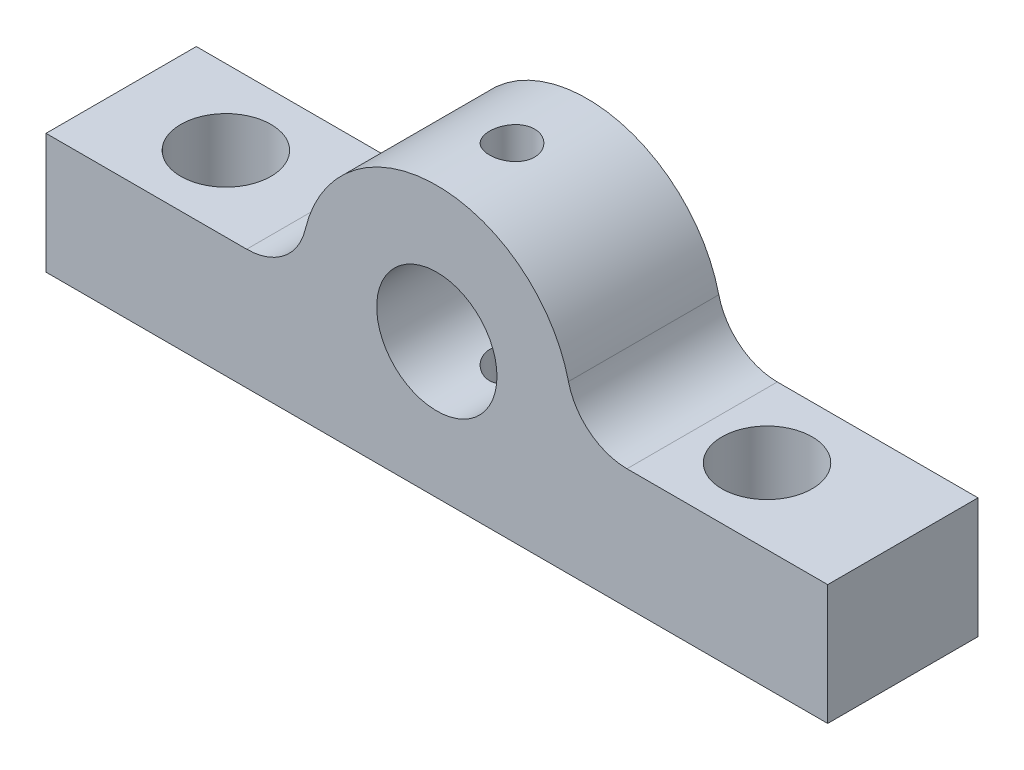
ISO-10303-21;
HEADER;
FILE_DESCRIPTION(('STEP AP214'),'2;1');
FILE_NAME('part.step','',(''),(''),'','','');
FILE_SCHEMA(('AUTOMOTIVE_DESIGN { 1 0 10303 214 1 1 1 1 }'));
ENDSEC;
DATA;
#1=APPLICATION_CONTEXT('core data for automotive mechanical design processes');
#2=APPLICATION_PROTOCOL_DEFINITION('international standard','automotive_design',2000,#1);
#3=PRODUCT_CONTEXT('',#1,'mechanical');
#4=PRODUCT('Part','Part','',(#3));
#5=PRODUCT_RELATED_PRODUCT_CATEGORY('part','',(#4));
#6=PRODUCT_DEFINITION_FORMATION('','',#4);
#7=PRODUCT_DEFINITION_CONTEXT('part definition',#1,'design');
#8=PRODUCT_DEFINITION('design','',#6,#7);
#9=PRODUCT_DEFINITION_SHAPE('','',#8);
#10=(LENGTH_UNIT() NAMED_UNIT(*) SI_UNIT(.MILLI.,.METRE.));
#11=(NAMED_UNIT(*) PLANE_ANGLE_UNIT() SI_UNIT($,.RADIAN.));
#12=(NAMED_UNIT(*) SI_UNIT($,.STERADIAN.) SOLID_ANGLE_UNIT());
#13=UNCERTAINTY_MEASURE_WITH_UNIT(LENGTH_MEASURE(1.E-05),#10,'distance_accuracy_value','');
#14=(GEOMETRIC_REPRESENTATION_CONTEXT(3) GLOBAL_UNCERTAINTY_ASSIGNED_CONTEXT((#13)) GLOBAL_UNIT_ASSIGNED_CONTEXT((#10,
#11,#12)) REPRESENTATION_CONTEXT('',''));
#15=CARTESIAN_POINT('',(0.,0.,0.));
#16=DIRECTION('',(0.,0.,1.));
#17=DIRECTION('',(1.,0.,0.));
#18=AXIS2_PLACEMENT_3D('',#15,#16,#17);
#19=CARTESIAN_POINT('',(0.,4.5,5.));
#20=DIRECTION('',(0.,0.,-1.));
#21=DIRECTION('',(-1.,0.,0.));
#22=AXIS2_PLACEMENT_3D('',#19,#20,#21);
#23=CYLINDRICAL_SURFACE('',#22,4.5);
#24=CARTESIAN_POINT('',(0.,4.5,0.));
#25=DIRECTION('',(0.,0.,1.));
#26=DIRECTION('',(1.,0.,0.));
#27=AXIS2_PLACEMENT_3D('',#24,#25,#26);
#28=CIRCLE('',#27,4.5);
#29=CARTESIAN_POINT('',(4.37853829869468,5.53846153846154,0.));
#30=VERTEX_POINT('',#29);
#31=CARTESIAN_POINT('',(-4.37853829869468,5.53846153846154,0.));
#32=VERTEX_POINT('',#31);
#33=EDGE_CURVE('E163',#30,#32,#28,.T.);
#34=ORIENTED_EDGE('',*,*,#33,.T.);
#35=DIRECTION('',(0.,0.,-1.));
#36=VECTOR('',#35,1.);
#37=CARTESIAN_POINT('',(-4.37853829869468,5.53846153846154,5.));
#38=LINE('',#37,#36);
#39=CARTESIAN_POINT('',(-4.37853829869468,5.53846153846154,5.));
#40=VERTEX_POINT('',#39);
#41=EDGE_CURVE('E61',#40,#32,#38,.T.);
#42=ORIENTED_EDGE('',*,*,#41,.F.);
#43=CARTESIAN_POINT('',(0.,4.5,5.));
#44=DIRECTION('',(0.,0.,1.));
#45=DIRECTION('',(1.,0.,0.));
#46=AXIS2_PLACEMENT_3D('',#43,#44,#45);
#47=CIRCLE('',#46,4.5);
#48=CARTESIAN_POINT('',(4.37853829869468,5.53846153846154,5.));
#49=VERTEX_POINT('',#48);
#50=EDGE_CURVE('E108',#49,#40,#47,.T.);
#51=ORIENTED_EDGE('',*,*,#50,.F.);
#52=DIRECTION('',(0.,0.,-1.));
#53=VECTOR('',#52,1.);
#54=CARTESIAN_POINT('',(4.37853829869468,5.53846153846154,5.));
#55=LINE('',#54,#53);
#56=EDGE_CURVE('E11',#49,#30,#55,.T.);
#57=ORIENTED_EDGE('',*,*,#56,.T.);
#58=EDGE_LOOP('',(#34,#42,#51,#57));
#59=FACE_BOUND('',#58,.T.);
#60=CARTESIAN_POINT('',(0.,9.,1.75));
#61=CARTESIAN_POINT('',(-0.0418172714874644,8.99999928350647,1.75000167668434));
#62=CARTESIAN_POINT('',(-0.0836573645516462,8.9994110337391,1.75350918249068));
#63=CARTESIAN_POINT('',(-0.166164066501913,8.99712103482416,1.7674406976296));
#64=CARTESIAN_POINT('',(-0.206829560387774,8.99541826177167,1.77787106707348));
#65=CARTESIAN_POINT('',(-0.285781424163793,8.99109020470935,1.80532463457783));
#66=CARTESIAN_POINT('',(-0.32406971052957,8.98846567547758,1.82234243969217));
#67=CARTESIAN_POINT('',(-0.397242552593383,8.98258268124621,1.86247368761572));
#68=CARTESIAN_POINT('',(-0.432127496963577,8.9793242887633,1.8855864332449));
#69=CARTESIAN_POINT('',(-0.497841784287504,8.97249995237494,1.93748652514614));
#70=CARTESIAN_POINT('',(-0.528633871060491,8.96893161544457,1.96632073439084));
#71=CARTESIAN_POINT('',(-0.584966549597978,8.96190788063019,2.02874439054184));
#72=CARTESIAN_POINT('',(-0.610506809817291,8.958452489888,2.06233413743698));
#73=CARTESIAN_POINT('',(-0.65576013768154,8.95202269727934,2.13357128985912));
#74=CARTESIAN_POINT('',(-0.6754363658583,8.94905138727491,2.17124240104143));
#75=CARTESIAN_POINT('',(-0.708167509623366,8.94395936938402,2.24941286929019));
#76=CARTESIAN_POINT('',(-0.721222872469684,8.94183860404292,2.28991203510329));
#77=CARTESIAN_POINT('',(-0.740224313335442,8.93871161052826,2.37219408245696));
#78=CARTESIAN_POINT('',(-0.746234708740621,8.9376953054571,2.41396172095042));
#79=CARTESIAN_POINT('',(-0.751175017586963,8.93686181680995,2.49792408306504));
#80=CARTESIAN_POINT('',(-0.750105432116699,8.93704454837164,2.54011877625019));
#81=CARTESIAN_POINT('',(-0.740968529518846,8.93857928659066,2.62327835838264));
#82=CARTESIAN_POINT('',(-0.732973464566932,8.93991921995675,2.66425144106357));
#83=CARTESIAN_POINT('',(-0.710325942121034,8.94359848563302,2.74426639534874));
#84=CARTESIAN_POINT('',(-0.695673256295922,8.94593785221981,2.78330820066656));
#85=CARTESIAN_POINT('',(-0.660053173828174,8.9513654380023,2.85856864703228));
#86=CARTESIAN_POINT('',(-0.639055774163914,8.95445720132197,2.89477282182437));
#87=CARTESIAN_POINT('',(-0.59136360526723,8.96103875524503,2.96317132016152));
#88=CARTESIAN_POINT('',(-0.564668376196286,8.96452857796286,2.99536531973648));
#89=CARTESIAN_POINT('',(-0.505944663647716,8.97156608363935,3.0552478257422));
#90=CARTESIAN_POINT('',(-0.473854189161938,8.97511394769495,3.08287555556202));
#91=CARTESIAN_POINT('',(-0.405460574694494,8.98182780419017,3.1323633287996));
#92=CARTESIAN_POINT('',(-0.369157407571927,8.98499379416924,3.15422333505497));
#93=CARTESIAN_POINT('',(-0.293311774850014,8.99059167867873,3.19156066814089));
#94=CARTESIAN_POINT('',(-0.253766617669398,8.99302295522234,3.20703262579938));
#95=CARTESIAN_POINT('',(-0.172589503680819,8.99687250903798,3.23109826457379));
#96=CARTESIAN_POINT('',(-0.13095772175384,8.99829087105142,3.23969252109212));
#97=CARTESIAN_POINT('',(-0.0473129703904871,8.99994338952806,3.24967640753834));
#98=CARTESIAN_POINT('',(-0.00531022114530334,9.00019125903835,3.25114947154168));
#99=CARTESIAN_POINT('',(0.0783419318669663,8.99951242326351,3.24707159667156));
#100=CARTESIAN_POINT('',(0.119991349167612,8.99858576317235,3.24152092805988));
#101=CARTESIAN_POINT('',(0.201496852664029,8.9956704808146,3.22362254519936));
#102=CARTESIAN_POINT('',(0.241362260515614,8.99368831440393,3.21131613748296));
#103=CARTESIAN_POINT('',(0.318464065458133,8.98888339336608,3.18029964454014));
#104=CARTESIAN_POINT('',(0.355700314772916,8.98606059153606,3.16158919970942));
#105=CARTESIAN_POINT('',(0.426849206840687,8.97985354890722,3.11810466259096));
#106=CARTESIAN_POINT('',(0.460729575281144,8.97646456766106,3.09327845314982));
#107=CARTESIAN_POINT('',(0.523873075650806,8.9695154021757,3.03833880538448));
#108=CARTESIAN_POINT('',(0.553135871908975,8.96595520551464,3.008224983017));
#109=CARTESIAN_POINT('',(0.606522833897401,8.95902052570754,2.94319073557857));
#110=CARTESIAN_POINT('',(0.630590628334115,8.95564834841132,2.90822375034568));
#111=CARTESIAN_POINT('',(0.672510693088496,8.94951458933365,2.83469410925844));
#112=CARTESIAN_POINT('',(0.690363160430947,8.94675298819806,2.79613156743175));
#113=CARTESIAN_POINT('',(0.719261499441945,8.94217036109311,2.71666308015636));
#114=CARTESIAN_POINT('',(0.730335429764384,8.94034546293319,2.67576757149085));
#115=CARTESIAN_POINT('',(0.745450636133483,8.93783315050578,2.59266396123347));
#116=CARTESIAN_POINT('',(0.74949252358385,8.93714563734816,2.55045597408038));
#117=CARTESIAN_POINT('',(0.750411859814206,8.93699019925203,2.46648845021128));
#118=CARTESIAN_POINT('',(0.747378040837556,8.93750716951695,2.42472988642741));
#119=CARTESIAN_POINT('',(0.734423951687055,8.93966934436118,2.34232622558477));
#120=CARTESIAN_POINT('',(0.724503703833743,8.94131454528364,2.30168112491744));
#121=CARTESIAN_POINT('',(0.69809234687847,8.94554206884516,2.22269246881222));
#122=CARTESIAN_POINT('',(0.681608877180133,8.94812330165901,2.18434629698319));
#123=CARTESIAN_POINT('',(0.642548101174773,8.95393310676662,2.11094929924155));
#124=CARTESIAN_POINT('',(0.619970492624569,8.9571617111652,2.07589863688836));
#125=CARTESIAN_POINT('',(0.569045665311646,8.96395036213686,2.00963932506767));
#126=CARTESIAN_POINT('',(0.540633169078094,8.96751388672891,1.97848119498992));
#127=CARTESIAN_POINT('',(0.478982709414069,8.97454311708252,1.92134451865752));
#128=CARTESIAN_POINT('',(0.445743633873791,8.97800880007964,1.89536716940855));
#129=CARTESIAN_POINT('',(0.375110750892084,8.98447958892666,1.84916551954002));
#130=CARTESIAN_POINT('',(0.337689836259845,8.98748134875931,1.82898218820611));
#131=CARTESIAN_POINT('',(0.259953920813694,8.99265350280533,1.79521915461702));
#132=CARTESIAN_POINT('',(0.219641848449003,8.99482472453244,1.78163287567609));
#133=CARTESIAN_POINT('',(0.14931099301362,8.99761737249886,1.764398417762));
#134=CARTESIAN_POINT('',(0.119717649089534,8.99850608182008,1.75900765911521));
#135=CARTESIAN_POINT('',(0.0600867930959429,8.99969764795836,1.75180787864657));
#136=CARTESIAN_POINT('',(0.0300492886825484,9.00000051486192,1.74999879515879));
#137=CARTESIAN_POINT('',(0.,9.,1.75));
#138=B_SPLINE_CURVE_WITH_KNOTS('',3,(#60,#61,#62,#63,#64,#65,#66,#67,#68,#69,#70,#71,#72,#73,
#74,#75,#76,#77,#78,#79,#80,#81,#82,#83,#84,#85,#86,#87,#88,#89,#90,#91,#92,#93,#94,#95,#96,#97,
#98,#99,#100,#101,#102,#103,#104,#105,#106,#107,#108,#109,#110,#111,#112,#113,#114,#115,#116,
#117,#118,#119,#120,#121,#122,#123,#124,#125,#126,#127,#128,#129,#130,#131,#132,#133,#134,#135,
#136,#137),.UNSPECIFIED.,.T.,.F.,(4,2,2,2,2,2,2,2,2,2,2,2,2,2,2,2,2,2,2,2,2,2,2,2,2,2,2,2,2,2,2,
2,2,2,2,2,2,2,4),(0.,0.125341975481553,0.250799263708626,0.376154060107581,0.501494523802437,
0.627907473186997,0.75432840050957,0.88152756247152,1.00871813062854,1.13473823131027,
1.26074941296266,1.38546156528123,1.51017799507614,1.63549366989767,1.76081946204172,
1.88769830973398,2.01457797490754,2.14156406674771,2.26853953356345,2.39402365047419,
2.51950293910758,2.64422342101925,2.7689509074782,2.89478047688107,3.02061918916285,
3.14776146602286,3.27489971212783,3.40150806702532,3.52810541335985,3.6531237285681,
3.7781416385644,3.90301445467867,4.02789346508801,4.15425415258018,4.28064400163692,
4.4079066948216,4.53504225639022,4.62511274449205,4.7151816818309),.UNSPECIFIED.);
#139=CARTESIAN_POINT('',(0.,9.,1.75));
#140=VERTEX_POINT('',#139);
#141=EDGE_CURVE('E233',#140,#140,#138,.T.);
#142=ORIENTED_EDGE('',*,*,#141,.F.);
#143=EDGE_LOOP('',(#142));
#144=FACE_BOUND('',#143,.T.);
#145=ADVANCED_FACE('F45',(#59,#144),#23,.T.);
#146=CARTESIAN_POINT('',(0.,4.5,5.));
#147=DIRECTION('',(0.,0.,-1.));
#148=DIRECTION('',(-1.,0.,0.));
#149=AXIS2_PLACEMENT_3D('',#146,#147,#148);
#150=CYLINDRICAL_SURFACE('',#149,2.);
#151=CARTESIAN_POINT('',(0.,2.5,1.75));
#152=CARTESIAN_POINT('',(0.0406175294689264,2.49999891271924,1.74999854884844));
#153=CARTESIAN_POINT('',(0.0812251208908961,2.50124810358408,1.75330988012419));
#154=CARTESIAN_POINT('',(0.16122672617618,2.50610651996536,1.76641409763496));
#155=CARTESIAN_POINT('',(0.200620913993808,2.50971540553003,1.77620605023528));
#156=CARTESIAN_POINT('',(0.277030392495439,2.51890583804227,1.80187650088588));
#157=CARTESIAN_POINT('',(0.314050112081139,2.5244835782528,1.81774325841089));
#158=CARTESIAN_POINT('',(0.384899655080127,2.53705616117323,1.85505320650791));
#159=CARTESIAN_POINT('',(0.41872861958894,2.54405138386226,1.87649789277208));
#160=CARTESIAN_POINT('',(0.483673208522913,2.55906876514391,1.92530626553545));
#161=CARTESIAN_POINT('',(0.514635365075596,2.56711998708217,1.9528651311297));
#162=CARTESIAN_POINT('',(0.571622107371815,2.58319889564336,2.01270521732942));
#163=CARTESIAN_POINT('',(0.597645181796013,2.59122657432483,2.04498787804394));
#164=CARTESIAN_POINT('',(0.644991011079925,2.60668764691134,2.11485873376161));
#165=CARTESIAN_POINT('',(0.666096965978799,2.61408675589591,2.15260218327291));
#166=CARTESIAN_POINT('',(0.701593231670422,2.62700069881283,2.23142417708426));
#167=CARTESIAN_POINT('',(0.715986224806196,2.63251628512059,2.27250138157755));
#168=CARTESIAN_POINT('',(0.737042155087746,2.64072793587932,2.3550583701291));
#169=CARTESIAN_POINT('',(0.743997966092789,2.64353037824581,2.39645251921772));
#170=CARTESIAN_POINT('',(0.75089778265824,2.64630969269392,2.47990807899692));
#171=CARTESIAN_POINT('',(0.750844684013152,2.64628773170347,2.52196920693724));
#172=CARTESIAN_POINT('',(0.74395214805009,2.64351244183973,2.60288476260648));
#173=CARTESIAN_POINT('',(0.737519042545017,2.64092265564439,2.64178045302209));
#174=CARTESIAN_POINT('',(0.71872083934165,2.63357530970235,2.71789357520266));
#175=CARTESIAN_POINT('',(0.706354848316292,2.62881742350568,2.75511075330694));
#176=CARTESIAN_POINT('',(0.675818742859519,2.61757148904873,2.82763853386412));
#177=CARTESIAN_POINT('',(0.657543243685503,2.61105241005917,2.86289974306065));
#178=CARTESIAN_POINT('',(0.615780368813488,2.5970289493034,2.92997286879549));
#179=CARTESIAN_POINT('',(0.592291193644483,2.58952422771421,2.96178358875985));
#180=CARTESIAN_POINT('',(0.538908903832744,2.57375980570443,3.02330183182544));
#181=CARTESIAN_POINT('',(0.508691493584778,2.56548326272164,3.05272432037405));
#182=CARTESIAN_POINT('',(0.44365629540951,2.54954135917957,3.1061689831029));
#183=CARTESIAN_POINT('',(0.408837801748682,2.54187609267024,3.13019032730284));
#184=CARTESIAN_POINT('',(0.334861718496209,2.5278680259546,3.17246519853126));
#185=CARTESIAN_POINT('',(0.295645356922359,2.52154750870192,3.19062379061053));
#186=CARTESIAN_POINT('',(0.214418425262291,2.51110640836519,3.21999130213502));
#187=CARTESIAN_POINT('',(0.172409105422884,2.50698484829254,3.23120330828056));
#188=CARTESIAN_POINT('',(0.0891876215743321,2.50157778385967,3.24581139377097));
#189=CARTESIAN_POINT('',(0.0480518097811032,2.50015315487154,3.24959130319125));
#190=CARTESIAN_POINT('',(-0.034286237627511,2.49987053149939,3.25034553194996));
#191=CARTESIAN_POINT('',(-0.0754884564916818,2.50101196806578,3.2473213601584));
#192=CARTESIAN_POINT('',(-0.155131024280934,2.50564145113669,3.23484497884566));
#193=CARTESIAN_POINT('',(-0.193616664003685,2.50903764518814,3.22564422813142));
#194=CARTESIAN_POINT('',(-0.268470877478594,2.51774261454174,3.20140696372638));
#195=CARTESIAN_POINT('',(-0.304839175173705,2.52305163859108,3.18636969102611));
#196=CARTESIAN_POINT('',(-0.375623882555142,2.53525187796032,3.15040679378013));
#197=CARTESIAN_POINT('',(-0.409951541779141,2.54218499894846,3.12932113538779));
#198=CARTESIAN_POINT('',(-0.474696355863069,2.55686664218147,3.08204094841474));
#199=CARTESIAN_POINT('',(-0.505112060134316,2.56461546497034,3.05584453372935));
#200=CARTESIAN_POINT('',(-0.563015399373234,2.58063335252609,2.99729793893583));
#201=CARTESIAN_POINT('',(-0.590230770621532,2.58890651740867,2.96467890860585));
#202=CARTESIAN_POINT('',(-0.638855250155826,2.60460592133842,2.89517430765397));
#203=CARTESIAN_POINT('',(-0.660263837058794,2.61203208429981,2.85828835433493));
#204=CARTESIAN_POINT('',(-0.696688867605184,2.62516585061342,2.78099200659231));
#205=CARTESIAN_POINT('',(-0.711678427280393,2.63086619733452,2.74056762695143));
#206=CARTESIAN_POINT('',(-0.734539417381085,2.63972983452741,2.65749511805843));
#207=CARTESIAN_POINT('',(-0.742415251539798,2.64289469444833,2.61484838187077));
#208=CARTESIAN_POINT('',(-0.750431735478743,2.64612052628473,2.53149192024841));
#209=CARTESIAN_POINT('',(-0.751036657476389,2.64636777744957,2.49083368414663));
#210=CARTESIAN_POINT('',(-0.745683578210761,2.64420793620727,2.41002734185684));
#211=CARTESIAN_POINT('',(-0.739726199251356,2.641801095488,2.36987918766287));
#212=CARTESIAN_POINT('',(-0.721779078150491,2.6347592920898,2.29247638664302));
#213=CARTESIAN_POINT('',(-0.709978991582428,2.63019457312124,2.25517082687768));
#214=CARTESIAN_POINT('',(-0.68084848389979,2.61939225850622,2.18304724575244));
#215=CARTESIAN_POINT('',(-0.663516664724776,2.61315424002268,2.14822985596483));
#216=CARTESIAN_POINT('',(-0.622760379690713,2.59930138048149,2.08008660515128));
#217=CARTESIAN_POINT('',(-0.599064164015036,2.59163150779553,2.04693460160007));
#218=CARTESIAN_POINT('',(-0.546672428649545,2.57596876621376,1.98492921951437));
#219=CARTESIAN_POINT('',(-0.517975320064045,2.56797579528418,1.95607721260662));
#220=CARTESIAN_POINT('',(-0.454540198392307,2.55204787695069,1.90189902208909));
#221=CARTESIAN_POINT('',(-0.419559322106495,2.5441394754968,1.87684812328267));
#222=CARTESIAN_POINT('',(-0.345606611600411,2.52972742771482,1.83298867236172));
#223=CARTESIAN_POINT('',(-0.306634467045311,2.52322389074219,1.81418060613182));
#224=CARTESIAN_POINT('',(-0.223999541001155,2.51212853696661,1.78281158547584));
#225=CARTESIAN_POINT('',(-0.180206711117104,2.50763171420822,1.77055646769905));
#226=CARTESIAN_POINT('',(-0.0909378668031911,2.50156878910206,1.75415352003966));
#227=CARTESIAN_POINT('',(-0.0454627081824295,2.50000121698016,1.75000162425634));
#228=CARTESIAN_POINT('',(0.,2.5,1.75));
#229=B_SPLINE_CURVE_WITH_KNOTS('',3,(#151,#152,#153,#154,#155,#156,#157,#158,#159,#160,#161,
#162,#163,#164,#165,#166,#167,#168,#169,#170,#171,#172,#173,#174,#175,#176,#177,#178,#179,#180,
#181,#182,#183,#184,#185,#186,#187,#188,#189,#190,#191,#192,#193,#194,#195,#196,#197,#198,#199,
#200,#201,#202,#203,#204,#205,#206,#207,#208,#209,#210,#211,#212,#213,#214,#215,#216,#217,#218,
#219,#220,#221,#222,#223,#224,#225,#226,#227,#228),.UNSPECIFIED.,.T.,.F.,(4,2,2,2,2,2,2,2,2,2,2,
2,2,2,2,2,2,2,2,2,2,2,2,2,2,2,2,2,2,2,2,2,2,2,2,2,2,2,4),(0.,0.12168490078028,0.24335227476523,
0.364785684606787,0.486251689804745,0.612368092913577,0.738523024628108,0.869483372508293,
1.00039134676067,1.12592937208451,1.25141553039854,1.36939172559986,1.48738569030295,
1.60761204193509,1.72787995372129,1.85623076667906,1.98460128952533,2.11495687643038,
2.24525449849423,2.36862509817963,2.4919683419526,2.6105721896192,2.72919146627227,
2.851296109298,2.97344590009934,3.10268259727829,3.2319308946007,3.36171533360999,
3.49141937472669,3.61279381734541,3.73415675100045,3.85181571207682,3.96950443322668,
4.09336235936551,4.21725970992946,4.34786164821435,4.47847374896966,4.61474257510436,
4.75094300892479),.UNSPECIFIED.);
#230=CARTESIAN_POINT('',(0.,2.5,1.75));
#231=VERTEX_POINT('',#230);
#232=EDGE_CURVE('E211',#231,#231,#229,.T.);
#233=ORIENTED_EDGE('',*,*,#232,.T.);
#234=EDGE_LOOP('',(#233));
#235=FACE_BOUND('',#234,.T.);
#236=CARTESIAN_POINT('',(0.,4.5,5.));
#237=DIRECTION('',(0.,0.,1.));
#238=DIRECTION('',(1.,0.,0.));
#239=AXIS2_PLACEMENT_3D('',#236,#237,#238);
#240=CIRCLE('',#239,2.);
#241=CARTESIAN_POINT('',(2.,4.5,5.));
#242=VERTEX_POINT('',#241);
#243=EDGE_CURVE('E153',#242,#242,#240,.T.);
#244=ORIENTED_EDGE('',*,*,#243,.T.);
#245=EDGE_LOOP('',(#244));
#246=FACE_BOUND('',#245,.T.);
#247=CARTESIAN_POINT('',(0.,4.5,0.));
#248=DIRECTION('',(0.,0.,1.));
#249=DIRECTION('',(1.,0.,0.));
#250=AXIS2_PLACEMENT_3D('',#247,#248,#249);
#251=CIRCLE('',#250,2.);
#252=CARTESIAN_POINT('',(2.,4.5,0.));
#253=VERTEX_POINT('',#252);
#254=EDGE_CURVE('E188',#253,#253,#251,.T.);
#255=ORIENTED_EDGE('',*,*,#254,.F.);
#256=EDGE_LOOP('',(#255));
#257=FACE_BOUND('',#256,.T.);
#258=CARTESIAN_POINT('',(0.,6.5,1.75));
#259=CARTESIAN_POINT('',(-0.0406175294689264,6.50000108728075,1.74999854884844));
#260=CARTESIAN_POINT('',(-0.0812251208908961,6.49875189641592,1.75330988012419));
#261=CARTESIAN_POINT('',(-0.16122672617618,6.49389348003464,1.76641409763496));
#262=CARTESIAN_POINT('',(-0.200620913993808,6.49028459446996,1.77620605023528));
#263=CARTESIAN_POINT('',(-0.277030392495439,6.48109416195772,1.80187650088588));
#264=CARTESIAN_POINT('',(-0.314050112081139,6.4755164217472,1.81774325841089));
#265=CARTESIAN_POINT('',(-0.384899655080127,6.46294383882676,1.85505320650791));
#266=CARTESIAN_POINT('',(-0.41872861958894,6.45594861613774,1.87649789277208));
#267=CARTESIAN_POINT('',(-0.483673208522913,6.44093123485608,1.92530626553545));
#268=CARTESIAN_POINT('',(-0.514635365075596,6.43288001291783,1.9528651311297));
#269=CARTESIAN_POINT('',(-0.571622107371816,6.41680110435663,2.01270521732942));
#270=CARTESIAN_POINT('',(-0.597645181796013,6.40877342567516,2.04498787804394));
#271=CARTESIAN_POINT('',(-0.644991011079925,6.39331235308866,2.11485873376161));
#272=CARTESIAN_POINT('',(-0.666096965978799,6.38591324410409,2.15260218327291));
#273=CARTESIAN_POINT('',(-0.701593231670422,6.37299930118716,2.23142417708426));
#274=CARTESIAN_POINT('',(-0.715986224806196,6.3674837148794,2.27250138157755));
#275=CARTESIAN_POINT('',(-0.737042155087746,6.35927206412068,2.3550583701291));
#276=CARTESIAN_POINT('',(-0.743997966092789,6.35646962175419,2.39645251921772));
#277=CARTESIAN_POINT('',(-0.75089778265824,6.35369030730607,2.47990807899692));
#278=CARTESIAN_POINT('',(-0.750844684013152,6.35371226829652,2.52196920693724));
#279=CARTESIAN_POINT('',(-0.74395214805009,6.35648755816027,2.60288476260648));
#280=CARTESIAN_POINT('',(-0.737519042545017,6.35907734435561,2.64178045302209));
#281=CARTESIAN_POINT('',(-0.71872083934165,6.36642469029765,2.71789357520266));
#282=CARTESIAN_POINT('',(-0.706354848316292,6.37118257649431,2.75511075330694));
#283=CARTESIAN_POINT('',(-0.675818742859519,6.38242851095126,2.82763853386412));
#284=CARTESIAN_POINT('',(-0.657543243685503,6.38894758994083,2.86289974306065));
#285=CARTESIAN_POINT('',(-0.615780368813489,6.40297105069659,2.92997286879549));
#286=CARTESIAN_POINT('',(-0.592291193644483,6.41047577228579,2.96178358875985));
#287=CARTESIAN_POINT('',(-0.538908903832744,6.42624019429556,3.02330183182544));
#288=CARTESIAN_POINT('',(-0.508691493584778,6.43451673727835,3.05272432037405));
#289=CARTESIAN_POINT('',(-0.443656295409511,6.45045864082043,3.1061689831029));
#290=CARTESIAN_POINT('',(-0.408837801748682,6.45812390732976,3.13019032730284));
#291=CARTESIAN_POINT('',(-0.33486171849621,6.4721319740454,3.17246519853126));
#292=CARTESIAN_POINT('',(-0.295645356922359,6.47845249129808,3.19062379061053));
#293=CARTESIAN_POINT('',(-0.214418425262292,6.48889359163481,3.21999130213502));
#294=CARTESIAN_POINT('',(-0.172409105422884,6.49301515170746,3.23120330828056));
#295=CARTESIAN_POINT('',(-0.0891876215743322,6.49842221614033,3.24581139377097));
#296=CARTESIAN_POINT('',(-0.0480518097811034,6.49984684512845,3.24959130319125));
#297=CARTESIAN_POINT('',(0.0342862376275109,6.5001294685006,3.25034553194996));
#298=CARTESIAN_POINT('',(0.0754884564916817,6.49898803193422,3.2473213601584));
#299=CARTESIAN_POINT('',(0.155131024280934,6.4943585488633,3.23484497884566));
#300=CARTESIAN_POINT('',(0.193616664003685,6.49096235481185,3.22564422813142));
#301=CARTESIAN_POINT('',(0.268470877478594,6.48225738545825,3.20140696372638));
#302=CARTESIAN_POINT('',(0.304839175173705,6.47694836140892,3.18636969102611));
#303=CARTESIAN_POINT('',(0.375623882555142,6.46474812203967,3.15040679378013));
#304=CARTESIAN_POINT('',(0.409951541779141,6.45781500105153,3.12932113538779));
#305=CARTESIAN_POINT('',(0.47469635586307,6.44313335781852,3.08204094841474));
#306=CARTESIAN_POINT('',(0.505112060134316,6.43538453502965,3.05584453372935));
#307=CARTESIAN_POINT('',(0.563015399373234,6.41936664747391,2.99729793893583));
#308=CARTESIAN_POINT('',(0.590230770621533,6.41109348259133,2.96467890860585));
#309=CARTESIAN_POINT('',(0.638855250155827,6.39539407866157,2.89517430765397));
#310=CARTESIAN_POINT('',(0.660263837058795,6.38796791570018,2.85828835433493));
#311=CARTESIAN_POINT('',(0.696688867605184,6.37483414938657,2.78099200659231));
#312=CARTESIAN_POINT('',(0.711678427280393,6.36913380266547,2.74056762695143));
#313=CARTESIAN_POINT('',(0.734539417381086,6.36027016547258,2.65749511805843));
#314=CARTESIAN_POINT('',(0.742415251539798,6.35710530555166,2.61484838187077));
#315=CARTESIAN_POINT('',(0.750431735478743,6.35387947371526,2.53149192024841));
#316=CARTESIAN_POINT('',(0.751036657476389,6.35363222255043,2.49083368414663));
#317=CARTESIAN_POINT('',(0.745683578210761,6.35579206379272,2.41002734185684));
#318=CARTESIAN_POINT('',(0.739726199251356,6.358198904512,2.36987918766287));
#319=CARTESIAN_POINT('',(0.721779078150491,6.36524070791019,2.29247638664302));
#320=CARTESIAN_POINT('',(0.709978991582428,6.36980542687876,2.25517082687768));
#321=CARTESIAN_POINT('',(0.68084848389979,6.38060774149378,2.18304724575244));
#322=CARTESIAN_POINT('',(0.663516664724775,6.38684575997732,2.14822985596483));
#323=CARTESIAN_POINT('',(0.622760379690713,6.40069861951851,2.08008660515128));
#324=CARTESIAN_POINT('',(0.599064164015036,6.40836849220447,2.04693460160007));
#325=CARTESIAN_POINT('',(0.546672428649545,6.42403123378624,1.98492921951437));
#326=CARTESIAN_POINT('',(0.517975320064045,6.43202420471582,1.95607721260662));
#327=CARTESIAN_POINT('',(0.454540198392307,6.4479521230493,1.90189902208909));
#328=CARTESIAN_POINT('',(0.419559322106494,6.45586052450319,1.87684812328267));
#329=CARTESIAN_POINT('',(0.345606611600411,6.47027257228518,1.83298867236172));
#330=CARTESIAN_POINT('',(0.306634467045311,6.4767761092578,1.81418060613181));
#331=CARTESIAN_POINT('',(0.223999541001156,6.48787146303339,1.78281158547584));
#332=CARTESIAN_POINT('',(0.180206711117104,6.49236828579178,1.77055646769905));
#333=CARTESIAN_POINT('',(0.090937866803191,6.49843121089793,1.75415352003966));
#334=CARTESIAN_POINT('',(0.0454627081824294,6.49999878301983,1.75000162425634));
#335=CARTESIAN_POINT('',(0.,6.5,1.75));
#336=B_SPLINE_CURVE_WITH_KNOTS('',3,(#258,#259,#260,#261,#262,#263,#264,#265,#266,#267,#268,
#269,#270,#271,#272,#273,#274,#275,#276,#277,#278,#279,#280,#281,#282,#283,#284,#285,#286,#287,
#288,#289,#290,#291,#292,#293,#294,#295,#296,#297,#298,#299,#300,#301,#302,#303,#304,#305,#306,
#307,#308,#309,#310,#311,#312,#313,#314,#315,#316,#317,#318,#319,#320,#321,#322,#323,#324,#325,
#326,#327,#328,#329,#330,#331,#332,#333,#334,#335),.UNSPECIFIED.,.T.,.F.,(4,2,2,2,2,2,2,2,2,2,2,
2,2,2,2,2,2,2,2,2,2,2,2,2,2,2,2,2,2,2,2,2,2,2,2,2,2,2,4),(0.,0.12168490078028,0.24335227476523,
0.364785684606786,0.486251689804745,0.612368092913577,0.738523024628108,0.869483372508293,
1.00039134676067,1.12592937208451,1.25141553039854,1.36939172559986,1.48738569030295,
1.60761204193509,1.72787995372129,1.85623076667906,1.98460128952533,2.11495687643038,
2.24525449849423,2.36862509817963,2.4919683419526,2.6105721896192,2.72919146627227,
2.851296109298,2.97344590009934,3.10268259727829,3.2319308946007,3.36171533360999,
3.49141937472669,3.61279381734541,3.73415675100045,3.85181571207682,3.96950443322668,
4.09336235936551,4.21725970992946,4.34786164821435,4.47847374896966,4.61474257510436,
4.75094300892479),.UNSPECIFIED.);
#337=CARTESIAN_POINT('',(0.,6.5,1.75));
#338=VERTEX_POINT('',#337);
#339=EDGE_CURVE('E49',#338,#338,#336,.T.);
#340=ORIENTED_EDGE('',*,*,#339,.T.);
#341=EDGE_LOOP('',(#340));
#342=FACE_BOUND('',#341,.T.);
#343=ADVANCED_FACE('F218',(#235,#246,#257,#342),#150,.F.);
#344=CARTESIAN_POINT('',(6.32455532033676,6.,5.));
#345=DIRECTION('',(0.,0.,-1.));
#346=DIRECTION('',(-1.,0.,0.));
#347=AXIS2_PLACEMENT_3D('',#344,#345,#346);
#348=CYLINDRICAL_SURFACE('',#347,2.);
#349=CARTESIAN_POINT('',(6.32455532033676,6.,0.));
#350=DIRECTION('',(0.,0.,1.));
#351=DIRECTION('',(1.,0.,0.));
#352=AXIS2_PLACEMENT_3D('',#349,#350,#351);
#353=CIRCLE('',#352,2.);
#354=CARTESIAN_POINT('',(6.32455532033676,4.,0.));
#355=VERTEX_POINT('',#354);
#356=EDGE_CURVE('E160',#355,#30,#353,.F.);
#357=ORIENTED_EDGE('',*,*,#356,.T.);
#358=ORIENTED_EDGE('',*,*,#56,.F.);
#359=CARTESIAN_POINT('',(6.32455532033676,6.,5.));
#360=DIRECTION('',(0.,0.,1.));
#361=DIRECTION('',(1.,0.,0.));
#362=AXIS2_PLACEMENT_3D('',#359,#360,#361);
#363=CIRCLE('',#362,2.);
#364=CARTESIAN_POINT('',(6.32455532033676,4.,5.));
#365=VERTEX_POINT('',#364);
#366=EDGE_CURVE('E192',#365,#49,#363,.F.);
#367=ORIENTED_EDGE('',*,*,#366,.F.);
#368=DIRECTION('',(0.,0.,-1.));
#369=VECTOR('',#368,1.);
#370=CARTESIAN_POINT('',(6.32455532033676,4.,5.));
#371=LINE('',#370,#369);
#372=EDGE_CURVE('E70',#365,#355,#371,.T.);
#373=ORIENTED_EDGE('',*,*,#372,.T.);
#374=EDGE_LOOP('',(#357,#358,#367,#373));
#375=FACE_BOUND('',#374,.T.);
#376=ADVANCED_FACE('F47',(#375),#348,.F.);
#377=CARTESIAN_POINT('',(-6.32455532033676,6.,5.));
#378=DIRECTION('',(0.,0.,-1.));
#379=DIRECTION('',(-1.,0.,0.));
#380=AXIS2_PLACEMENT_3D('',#377,#378,#379);
#381=CYLINDRICAL_SURFACE('',#380,2.);
#382=CARTESIAN_POINT('',(-6.32455532033676,6.,0.));
#383=DIRECTION('',(0.,0.,1.));
#384=DIRECTION('',(1.,0.,0.));
#385=AXIS2_PLACEMENT_3D('',#382,#383,#384);
#386=CIRCLE('',#385,2.);
#387=CARTESIAN_POINT('',(-6.32455532033676,4.,0.));
#388=VERTEX_POINT('',#387);
#389=EDGE_CURVE('E167',#32,#388,#386,.F.);
#390=ORIENTED_EDGE('',*,*,#389,.T.);
#391=DIRECTION('',(0.,0.,-1.));
#392=VECTOR('',#391,1.);
#393=CARTESIAN_POINT('',(-6.32455532033676,4.,5.));
#394=LINE('',#393,#392);
#395=CARTESIAN_POINT('',(-6.32455532033676,4.,5.));
#396=VERTEX_POINT('',#395);
#397=EDGE_CURVE('E202',#396,#388,#394,.T.);
#398=ORIENTED_EDGE('',*,*,#397,.F.);
#399=CARTESIAN_POINT('',(-6.32455532033676,6.,5.));
#400=DIRECTION('',(0.,0.,1.));
#401=DIRECTION('',(1.,0.,0.));
#402=AXIS2_PLACEMENT_3D('',#399,#400,#401);
#403=CIRCLE('',#402,2.);
#404=EDGE_CURVE('E280',#40,#396,#403,.F.);
#405=ORIENTED_EDGE('',*,*,#404,.F.);
#406=ORIENTED_EDGE('',*,*,#41,.T.);
#407=EDGE_LOOP('',(#390,#398,#405,#406));
#408=FACE_BOUND('',#407,.T.);
#409=ADVANCED_FACE('F247',(#408),#381,.F.);
#410=CARTESIAN_POINT('',(0.,4.,5.));
#411=DIRECTION('',(0.,1.,0.));
#412=DIRECTION('',(0.,0.,1.));
#413=AXIS2_PLACEMENT_3D('',#410,#411,#412);
#414=PLANE('',#413);
#415=CARTESIAN_POINT('',(-9.51734514196891,4.,2.5));
#416=DIRECTION('',(0.,1.,0.));
#417=DIRECTION('',(0.,0.,1.));
#418=AXIS2_PLACEMENT_3D('',#415,#416,#417);
#419=CIRCLE('',#418,1.5);
#420=CARTESIAN_POINT('',(-9.51734514196891,4.,4.));
#421=VERTEX_POINT('',#420);
#422=EDGE_CURVE('E242',#421,#421,#419,.T.);
#423=ORIENTED_EDGE('',*,*,#422,.F.);
#424=EDGE_LOOP('',(#423));
#425=FACE_BOUND('',#424,.T.);
#426=DIRECTION('',(1.,0.,0.));
#427=VECTOR('',#426,1.);
#428=CARTESIAN_POINT('',(0.,4.,0.));
#429=LINE('',#428,#427);
#430=CARTESIAN_POINT('',(-13.,4.,0.));
#431=VERTEX_POINT('',#430);
#432=EDGE_CURVE('E171',#431,#388,#429,.T.);
#433=ORIENTED_EDGE('',*,*,#432,.F.);
#434=DIRECTION('',(0.,0.,-1.));
#435=VECTOR('',#434,1.);
#436=CARTESIAN_POINT('',(-13.,4.,5.));
#437=LINE('',#436,#435);
#438=CARTESIAN_POINT('',(-13.,4.,5.));
#439=VERTEX_POINT('',#438);
#440=EDGE_CURVE('E199',#439,#431,#437,.T.);
#441=ORIENTED_EDGE('',*,*,#440,.F.);
#442=DIRECTION('',(1.,0.,0.));
#443=VECTOR('',#442,1.);
#444=CARTESIAN_POINT('',(0.,4.,5.));
#445=LINE('',#444,#443);
#446=EDGE_CURVE('E285',#439,#396,#445,.T.);
#447=ORIENTED_EDGE('',*,*,#446,.T.);
#448=ORIENTED_EDGE('',*,*,#397,.T.);
#449=EDGE_LOOP('',(#433,#441,#447,#448));
#450=FACE_BOUND('',#449,.T.);
#451=ADVANCED_FACE('F250',(#425,#450),#414,.T.);
#452=CARTESIAN_POINT('',(-13.,0.,5.));
#453=DIRECTION('',(-1.,0.,0.));
#454=DIRECTION('',(0.,0.,1.));
#455=AXIS2_PLACEMENT_3D('',#452,#453,#454);
#456=PLANE('',#455);
#457=DIRECTION('',(0.,1.,0.));
#458=VECTOR('',#457,1.);
#459=CARTESIAN_POINT('',(-13.,0.,0.));
#460=LINE('',#459,#458);
#461=CARTESIAN_POINT('',(-13.,0.,0.));
#462=VERTEX_POINT('',#461);
#463=EDGE_CURVE('E175',#462,#431,#460,.T.);
#464=ORIENTED_EDGE('',*,*,#463,.F.);
#465=DIRECTION('',(0.,0.,-1.));
#466=VECTOR('',#465,1.);
#467=CARTESIAN_POINT('',(-13.,0.,5.));
#468=LINE('',#467,#466);
#469=CARTESIAN_POINT('',(-13.,0.,5.));
#470=VERTEX_POINT('',#469);
#471=EDGE_CURVE('E134',#470,#462,#468,.T.);
#472=ORIENTED_EDGE('',*,*,#471,.F.);
#473=DIRECTION('',(0.,1.,0.));
#474=VECTOR('',#473,1.);
#475=CARTESIAN_POINT('',(-13.,0.,5.));
#476=LINE('',#475,#474);
#477=EDGE_CURVE('E145',#470,#439,#476,.T.);
#478=ORIENTED_EDGE('',*,*,#477,.T.);
#479=ORIENTED_EDGE('',*,*,#440,.T.);
#480=EDGE_LOOP('',(#464,#472,#478,#479));
#481=FACE_BOUND('',#480,.T.);
#482=ADVANCED_FACE('F254',(#481),#456,.T.);
#483=CARTESIAN_POINT('',(0.,0.,5.));
#484=DIRECTION('',(0.,-1.,0.));
#485=DIRECTION('',(1.,0.,0.));
#486=AXIS2_PLACEMENT_3D('',#483,#484,#485);
#487=PLANE('',#486);
#488=CARTESIAN_POINT('',(0.,0.,2.5));
#489=DIRECTION('',(0.,1.,0.));
#490=DIRECTION('',(0.,0.,1.));
#491=AXIS2_PLACEMENT_3D('',#488,#489,#490);
#492=CIRCLE('',#491,0.75);
#493=CARTESIAN_POINT('',(0.,0.,3.25));
#494=VERTEX_POINT('',#493);
#495=EDGE_CURVE('E217',#494,#494,#492,.T.);
#496=ORIENTED_EDGE('',*,*,#495,.T.);
#497=EDGE_LOOP('',(#496));
#498=FACE_BOUND('',#497,.T.);
#499=CARTESIAN_POINT('',(-9.51734514196891,0.,2.5));
#500=DIRECTION('',(0.,-1.,0.));
#501=DIRECTION('',(1.,0.,0.));
#502=AXIS2_PLACEMENT_3D('',#499,#500,#501);
#503=CIRCLE('',#502,1.5);
#504=CARTESIAN_POINT('',(-8.01734514196891,0.,2.5));
#505=VERTEX_POINT('',#504);
#506=EDGE_CURVE('E164',#505,#505,#503,.T.);
#507=ORIENTED_EDGE('',*,*,#506,.F.);
#508=EDGE_LOOP('',(#507));
#509=FACE_BOUND('',#508,.T.);
#510=CARTESIAN_POINT('',(8.48265485803109,0.,2.5));
#511=DIRECTION('',(0.,-1.,0.));
#512=DIRECTION('',(1.,0.,0.));
#513=AXIS2_PLACEMENT_3D('',#510,#511,#512);
#514=CIRCLE('',#513,1.5);
#515=CARTESIAN_POINT('',(9.98265485803109,0.,2.5));
#516=VERTEX_POINT('',#515);
#517=EDGE_CURVE('E210',#516,#516,#514,.T.);
#518=ORIENTED_EDGE('',*,*,#517,.F.);
#519=EDGE_LOOP('',(#518));
#520=FACE_BOUND('',#519,.T.);
#521=DIRECTION('',(-1.,0.,0.));
#522=VECTOR('',#521,1.);
#523=CARTESIAN_POINT('',(0.,0.,0.));
#524=LINE('',#523,#522);
#525=CARTESIAN_POINT('',(13.,0.,0.));
#526=VERTEX_POINT('',#525);
#527=EDGE_CURVE('E129',#526,#462,#524,.T.);
#528=ORIENTED_EDGE('',*,*,#527,.F.);
#529=DIRECTION('',(0.,0.,-1.));
#530=VECTOR('',#529,1.);
#531=CARTESIAN_POINT('',(13.,0.,5.));
#532=LINE('',#531,#530);
#533=CARTESIAN_POINT('',(13.,0.,5.));
#534=VERTEX_POINT('',#533);
#535=EDGE_CURVE('E124',#534,#526,#532,.T.);
#536=ORIENTED_EDGE('',*,*,#535,.F.);
#537=DIRECTION('',(-1.,0.,0.));
#538=VECTOR('',#537,1.);
#539=CARTESIAN_POINT('',(0.,0.,5.));
#540=LINE('',#539,#538);
#541=EDGE_CURVE('E127',#534,#470,#540,.T.);
#542=ORIENTED_EDGE('',*,*,#541,.T.);
#543=ORIENTED_EDGE('',*,*,#471,.T.);
#544=EDGE_LOOP('',(#528,#536,#542,#543));
#545=FACE_BOUND('',#544,.T.);
#546=ADVANCED_FACE('F126',(#498,#509,#520,#545),#487,.T.);
#547=CARTESIAN_POINT('',(13.,0.,5.));
#548=DIRECTION('',(1.,0.,0.));
#549=DIRECTION('',(0.,0.,-1.));
#550=AXIS2_PLACEMENT_3D('',#547,#548,#549);
#551=PLANE('',#550);
#552=DIRECTION('',(0.,-1.,0.));
#553=VECTOR('',#552,1.);
#554=CARTESIAN_POINT('',(13.,0.,0.));
#555=LINE('',#554,#553);
#556=CARTESIAN_POINT('',(13.,4.,0.));
#557=VERTEX_POINT('',#556);
#558=EDGE_CURVE('E181',#557,#526,#555,.T.);
#559=ORIENTED_EDGE('',*,*,#558,.F.);
#560=DIRECTION('',(0.,0.,-1.));
#561=VECTOR('',#560,1.);
#562=CARTESIAN_POINT('',(13.,4.,5.));
#563=LINE('',#562,#561);
#564=CARTESIAN_POINT('',(13.,4.,5.));
#565=VERTEX_POINT('',#564);
#566=EDGE_CURVE('E96',#565,#557,#563,.T.);
#567=ORIENTED_EDGE('',*,*,#566,.F.);
#568=DIRECTION('',(0.,-1.,0.));
#569=VECTOR('',#568,1.);
#570=CARTESIAN_POINT('',(13.,0.,5.));
#571=LINE('',#570,#569);
#572=EDGE_CURVE('E142',#565,#534,#571,.T.);
#573=ORIENTED_EDGE('',*,*,#572,.T.);
#574=ORIENTED_EDGE('',*,*,#535,.T.);
#575=EDGE_LOOP('',(#559,#567,#573,#574));
#576=FACE_BOUND('',#575,.T.);
#577=ADVANCED_FACE('F148',(#576),#551,.T.);
#578=CARTESIAN_POINT('',(0.,4.,5.));
#579=DIRECTION('',(0.,1.,0.));
#580=DIRECTION('',(0.,0.,1.));
#581=AXIS2_PLACEMENT_3D('',#578,#579,#580);
#582=PLANE('',#581);
#583=CARTESIAN_POINT('',(8.48265485803109,4.,2.5));
#584=DIRECTION('',(0.,1.,0.));
#585=DIRECTION('',(0.,0.,1.));
#586=AXIS2_PLACEMENT_3D('',#583,#584,#585);
#587=CIRCLE('',#586,1.5);
#588=CARTESIAN_POINT('',(8.48265485803109,4.,4.));
#589=VERTEX_POINT('',#588);
#590=EDGE_CURVE('E241',#589,#589,#587,.T.);
#591=ORIENTED_EDGE('',*,*,#590,.F.);
#592=EDGE_LOOP('',(#591));
#593=FACE_BOUND('',#592,.T.);
#594=DIRECTION('',(1.,0.,0.));
#595=VECTOR('',#594,1.);
#596=CARTESIAN_POINT('',(0.,4.,0.));
#597=LINE('',#596,#595);
#598=EDGE_CURVE('E184',#355,#557,#597,.T.);
#599=ORIENTED_EDGE('',*,*,#598,.F.);
#600=ORIENTED_EDGE('',*,*,#372,.F.);
#601=DIRECTION('',(1.,0.,0.));
#602=VECTOR('',#601,1.);
#603=CARTESIAN_POINT('',(0.,4.,5.));
#604=LINE('',#603,#602);
#605=EDGE_CURVE('E150',#365,#565,#604,.T.);
#606=ORIENTED_EDGE('',*,*,#605,.T.);
#607=ORIENTED_EDGE('',*,*,#566,.T.);
#608=EDGE_LOOP('',(#599,#600,#606,#607));
#609=FACE_BOUND('',#608,.T.);
#610=ADVANCED_FACE('F263',(#593,#609),#582,.T.);
#611=CARTESIAN_POINT('',(0.,0.,5.));
#612=DIRECTION('',(0.,0.,1.));
#613=DIRECTION('',(1.,0.,0.));
#614=AXIS2_PLACEMENT_3D('',#611,#612,#613);
#615=PLANE('',#614);
#616=ORIENTED_EDGE('',*,*,#366,.T.);
#617=ORIENTED_EDGE('',*,*,#50,.T.);
#618=ORIENTED_EDGE('',*,*,#404,.T.);
#619=ORIENTED_EDGE('',*,*,#446,.F.);
#620=ORIENTED_EDGE('',*,*,#477,.F.);
#621=ORIENTED_EDGE('',*,*,#541,.F.);
#622=ORIENTED_EDGE('',*,*,#572,.F.);
#623=ORIENTED_EDGE('',*,*,#605,.F.);
#624=EDGE_LOOP('',(#616,#617,#618,#619,#620,#621,#622,#623));
#625=FACE_BOUND('',#624,.T.);
#626=ORIENTED_EDGE('',*,*,#243,.F.);
#627=EDGE_LOOP('',(#626));
#628=FACE_BOUND('',#627,.T.);
#629=ADVANCED_FACE('F139',(#625,#628),#615,.T.);
#630=CARTESIAN_POINT('',(0.,0.,0.));
#631=DIRECTION('',(0.,0.,1.));
#632=DIRECTION('',(1.,0.,0.));
#633=AXIS2_PLACEMENT_3D('',#630,#631,#632);
#634=PLANE('',#633);
#635=ORIENTED_EDGE('',*,*,#356,.F.);
#636=ORIENTED_EDGE('',*,*,#598,.T.);
#637=ORIENTED_EDGE('',*,*,#558,.T.);
#638=ORIENTED_EDGE('',*,*,#527,.T.);
#639=ORIENTED_EDGE('',*,*,#463,.T.);
#640=ORIENTED_EDGE('',*,*,#432,.T.);
#641=ORIENTED_EDGE('',*,*,#389,.F.);
#642=ORIENTED_EDGE('',*,*,#33,.F.);
#643=EDGE_LOOP('',(#635,#636,#637,#638,#639,#640,#641,#642));
#644=FACE_BOUND('',#643,.T.);
#645=ORIENTED_EDGE('',*,*,#254,.T.);
#646=EDGE_LOOP('',(#645));
#647=FACE_BOUND('',#646,.T.);
#648=ADVANCED_FACE('F269',(#644,#647),#634,.F.);
#649=CARTESIAN_POINT('',(8.48265485803109,-1.,2.5));
#650=DIRECTION('',(0.,1.,0.));
#651=DIRECTION('',(0.,0.,1.));
#652=AXIS2_PLACEMENT_3D('',#649,#650,#651);
#653=CYLINDRICAL_SURFACE('',#652,1.5);
#654=ORIENTED_EDGE('',*,*,#517,.T.);
#655=EDGE_LOOP('',(#654));
#656=FACE_BOUND('',#655,.T.);
#657=ORIENTED_EDGE('',*,*,#590,.T.);
#658=EDGE_LOOP('',(#657));
#659=FACE_BOUND('',#658,.T.);
#660=ADVANCED_FACE('F305',(#656,#659),#653,.F.);
#661=CARTESIAN_POINT('',(-9.51734514196891,-1.,2.5));
#662=DIRECTION('',(0.,1.,0.));
#663=DIRECTION('',(0.,0.,1.));
#664=AXIS2_PLACEMENT_3D('',#661,#662,#663);
#665=CYLINDRICAL_SURFACE('',#664,1.5);
#666=ORIENTED_EDGE('',*,*,#506,.T.);
#667=EDGE_LOOP('',(#666));
#668=FACE_BOUND('',#667,.T.);
#669=ORIENTED_EDGE('',*,*,#422,.T.);
#670=EDGE_LOOP('',(#669));
#671=FACE_BOUND('',#670,.T.);
#672=ADVANCED_FACE('F227',(#668,#671),#665,.F.);
#673=CARTESIAN_POINT('',(0.,9.,2.5));
#674=DIRECTION('',(0.,-1.,0.));
#675=DIRECTION('',(0.,0.,-1.));
#676=AXIS2_PLACEMENT_3D('',#673,#674,#675);
#677=CYLINDRICAL_SURFACE('',#676,0.75);
#678=ORIENTED_EDGE('',*,*,#232,.F.);
#679=EDGE_LOOP('',(#678));
#680=FACE_BOUND('',#679,.T.);
#681=ORIENTED_EDGE('',*,*,#495,.F.);
#682=EDGE_LOOP('',(#681));
#683=FACE_BOUND('',#682,.T.);
#684=ADVANCED_FACE('F222',(#680,#683),#677,.F.);
#685=ORIENTED_EDGE('',*,*,#339,.F.);
#686=EDGE_LOOP('',(#685));
#687=FACE_BOUND('',#686,.T.);
#688=ORIENTED_EDGE('',*,*,#141,.T.);
#689=EDGE_LOOP('',(#688));
#690=FACE_BOUND('',#689,.T.);
#691=ADVANCED_FACE('F226',(#687,#690),#677,.F.);
#692=CLOSED_SHELL('',(#145,#343,#376,#409,#451,#482,#546,#577,#610,#629,#648,#660,#672,#684,#691));
#693=MANIFOLD_SOLID_BREP('B2',#692);
#694=ADVANCED_BREP_SHAPE_REPRESENTATION('',(#18,#693),#14);
#695=SHAPE_DEFINITION_REPRESENTATION(#9,#694);
ENDSEC;
END-ISO-10303-21;
